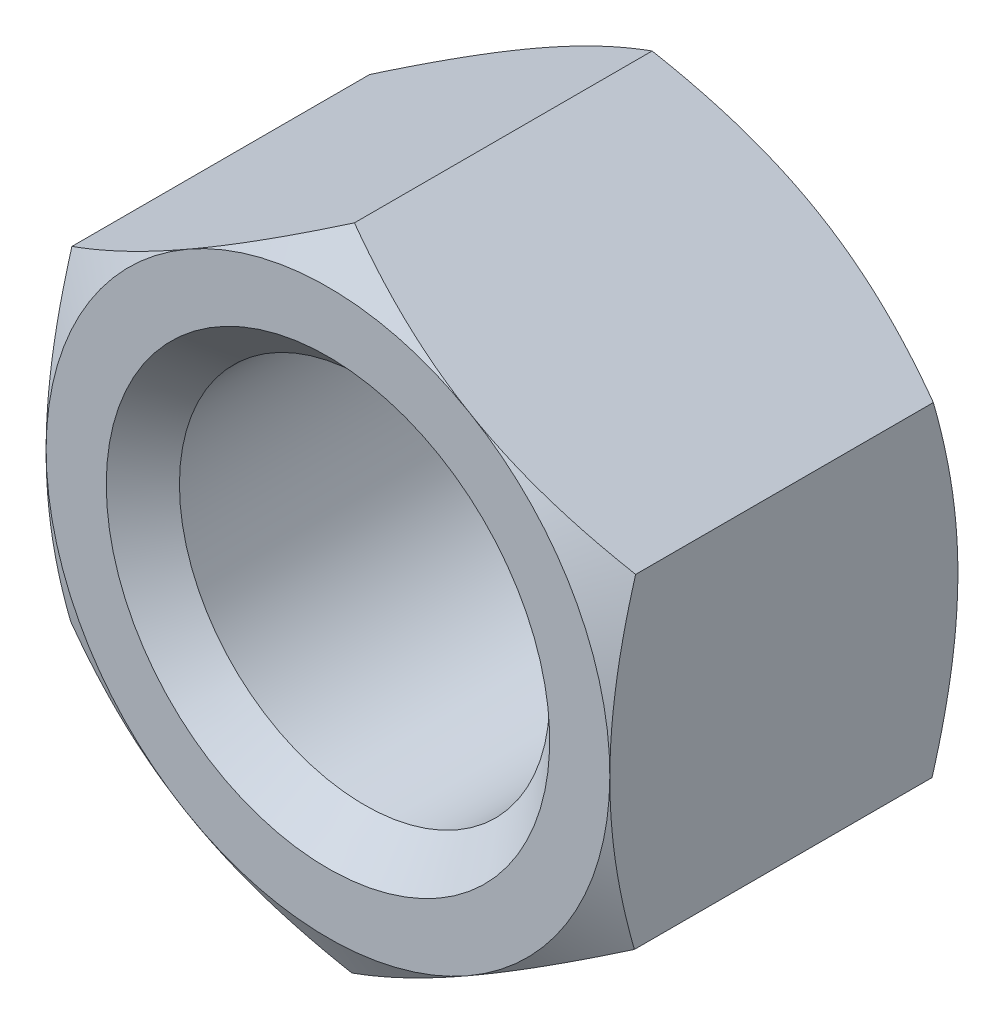
ISO-10303-21;
HEADER;
FILE_DESCRIPTION(('STEP AP214'),'2;1');
FILE_NAME('part.step','',(''),(''),'','','');
FILE_SCHEMA(('AUTOMOTIVE_DESIGN { 1 0 10303 214 1 1 1 1 }'));
ENDSEC;
DATA;
#1=APPLICATION_CONTEXT('core data for automotive mechanical design processes');
#2=APPLICATION_PROTOCOL_DEFINITION('international standard','automotive_design',2000,#1);
#3=PRODUCT_CONTEXT('',#1,'mechanical');
#4=PRODUCT('Part','Part','',(#3));
#5=PRODUCT_RELATED_PRODUCT_CATEGORY('part','',(#4));
#6=PRODUCT_DEFINITION_FORMATION('','',#4);
#7=PRODUCT_DEFINITION_CONTEXT('part definition',#1,'design');
#8=PRODUCT_DEFINITION('design','',#6,#7);
#9=PRODUCT_DEFINITION_SHAPE('','',#8);
#10=(LENGTH_UNIT() NAMED_UNIT(*) SI_UNIT(.MILLI.,.METRE.));
#11=(NAMED_UNIT(*) PLANE_ANGLE_UNIT() SI_UNIT($,.RADIAN.));
#12=(NAMED_UNIT(*) SI_UNIT($,.STERADIAN.) SOLID_ANGLE_UNIT());
#13=UNCERTAINTY_MEASURE_WITH_UNIT(LENGTH_MEASURE(1.E-05),#10,'distance_accuracy_value','');
#14=(GEOMETRIC_REPRESENTATION_CONTEXT(3) GLOBAL_UNCERTAINTY_ASSIGNED_CONTEXT((#13)) GLOBAL_UNIT_ASSIGNED_CONTEXT((#10,
#11,#12)) REPRESENTATION_CONTEXT('',''));
#15=CARTESIAN_POINT('',(0.,0.,0.));
#16=DIRECTION('',(0.,0.,1.));
#17=DIRECTION('',(1.,0.,0.));
#18=AXIS2_PLACEMENT_3D('',#15,#16,#17);
#19=CARTESIAN_POINT('',(3.81479636275758,2.18251087298359,4.7));
#20=DIRECTION('',(-0.503402758571273,-0.86405188655707,0.));
#21=DIRECTION('',(0.86405188655707,-0.503402758571273,0.));
#22=AXIS2_PLACEMENT_3D('',#19,#20,#21);
#23=PLANE('',#22);
#24=CARTESIAN_POINT('',(3.81499636275758,2.18239435156481,4.35997874533726));
#25=CARTESIAN_POINT('',(3.64811550767101,2.27962032156767,4.41575327271758));
#26=CARTESIAN_POINT('',(3.47979414686309,2.37768554042254,4.46647812454732));
#27=CARTESIAN_POINT('',(3.1402367783481,2.57551407209181,4.5550187537456));
#28=CARTESIAN_POINT('',(2.96899473728966,2.67528089997952,4.59280320888649));
#29=CARTESIAN_POINT('',(2.62863287329639,2.87357813642141,4.65162006952883));
#30=CARTESIAN_POINT('',(2.45956541847096,2.97207803494357,4.67304393485062));
#31=CARTESIAN_POINT('',(2.12063500890943,3.16954129587899,4.69861932626903));
#32=CARTESIAN_POINT('',(1.95077328605247,3.26850394059074,4.70279203126259));
#33=CARTESIAN_POINT('',(1.63337851805591,3.45342038397959,4.69411027525601));
#34=CARTESIAN_POINT('',(1.48579795454608,3.53940186719627,4.68338747949839));
#35=CARTESIAN_POINT('',(1.19159831160526,3.71080466618468,4.64940284759646));
#36=CARTESIAN_POINT('',(1.04498024971571,3.79622538912953,4.62612940280024));
#37=CARTESIAN_POINT('',(0.750174047424613,3.96798157389826,4.56794772366122));
#38=CARTESIAN_POINT('',(0.602023218516453,4.05429529778139,4.53279286465761));
#39=CARTESIAN_POINT('',(0.307931167384401,4.22563541301876,4.45300520988815));
#40=CARTESIAN_POINT('',(0.161986177547433,4.31066399941111,4.40839116089044));
#41=CARTESIAN_POINT('',(0.0170883213392543,4.3950825183231,4.35997874533726));
#42=B_SPLINE_CURVE_WITH_KNOTS('',3,(#24,#25,#26,#27,#28,#29,#30,#31,#32,#33,#34,#35,#36,#37,#38,
#39,#40,#41),.UNSPECIFIED.,.F.,.F.,(4,2,2,2,2,2,2,2,4),(0.,0.603326111642062,1.20810242030768,
1.79791084320572,2.38699495494449,2.89991736117028,3.41331500784669,3.93810051431454,
4.46185553318586),.UNSPECIFIED.);
#43=CARTESIAN_POINT('',(3.81479636275758,2.18251087298359,4.3600455669116));
#44=VERTEX_POINT('',#43);
#45=CARTESIAN_POINT('',(1.91604234204841,3.28873843494396,4.7));
#46=VERTEX_POINT('',#45);
#47=EDGE_CURVE('E63',#44,#46,#42,.T.);
#48=ORIENTED_EDGE('',*,*,#47,.F.);
#49=DIRECTION('',(0.,0.,-1.));
#50=VECTOR('',#49,1.);
#51=CARTESIAN_POINT('',(3.81479636275758,2.18251087298359,4.7));
#52=LINE('',#51,#50);
#53=CARTESIAN_POINT('',(3.81479636275758,2.18251087298359,0.339954433088404));
#54=VERTEX_POINT('',#53);
#55=EDGE_CURVE('E532',#44,#54,#52,.T.);
#56=ORIENTED_EDGE('',*,*,#55,.T.);
#57=CARTESIAN_POINT('',(0.0170883213392538,4.3950825183231,0.34002125466274));
#58=CARTESIAN_POINT('',(0.183969176425817,4.29785654832025,0.284246727282424));
#59=CARTESIAN_POINT('',(0.352290537233743,4.19979132946538,0.233521875452679));
#60=CARTESIAN_POINT('',(0.691847905748734,4.00196279779611,0.144981246254397));
#61=CARTESIAN_POINT('',(0.863089946807176,3.90219596990839,0.107196791113513));
#62=CARTESIAN_POINT('',(1.20345181080044,3.7038987334665,0.0483799304711651));
#63=CARTESIAN_POINT('',(1.37251926562587,3.60539883494435,0.026956065149377));
#64=CARTESIAN_POINT('',(1.7114496751874,3.40793557400892,0.00138067373097403));
#65=CARTESIAN_POINT('',(1.88131139804436,3.30897292929717,-0.00279203126258914));
#66=CARTESIAN_POINT('',(2.19870616604092,3.12405648590832,0.00588972474399352));
#67=CARTESIAN_POINT('',(2.34628672955075,3.03807500269164,0.0166125205016103));
#68=CARTESIAN_POINT('',(2.64048637249157,2.86667220370324,0.0505971524035392));
#69=CARTESIAN_POINT('',(2.78710443438112,2.78125148075838,0.0738705971997583));
#70=CARTESIAN_POINT('',(3.08191063667222,2.60949529598966,0.13205227633878));
#71=CARTESIAN_POINT('',(3.23006146558038,2.52318157210652,0.167207135342394));
#72=CARTESIAN_POINT('',(3.52415351671243,2.35184145686915,0.246994790111855));
#73=CARTESIAN_POINT('',(3.6700985065494,2.26681287047681,0.291608839109563));
#74=CARTESIAN_POINT('',(3.81499636275758,2.18239435156481,0.34002125466274));
#75=B_SPLINE_CURVE_WITH_KNOTS('',3,(#57,#58,#59,#60,#61,#62,#63,#64,#65,#66,#67,#68,#69,#70,#71,
#72,#73,#74),.UNSPECIFIED.,.F.,.F.,(4,2,2,2,2,2,2,2,4),(0.,0.603326111642062,1.20810242030768,
1.79791084320572,2.38699495494449,2.89991736117028,3.41331500784669,3.93810051431454,
4.46185553318586),.UNSPECIFIED.);
#76=CARTESIAN_POINT('',(1.91604234204841,3.28873843494396,0.));
#77=VERTEX_POINT('',#76);
#78=EDGE_CURVE('E235',#77,#54,#75,.T.);
#79=ORIENTED_EDGE('',*,*,#78,.F.);
#80=CARTESIAN_POINT('',(0.0172883213392539,4.39496599690433,0.339954433088403));
#81=VERTEX_POINT('',#80);
#82=EDGE_CURVE('E245',#81,#77,#75,.T.);
#83=ORIENTED_EDGE('',*,*,#82,.F.);
#84=DIRECTION('',(0.,0.,-1.));
#85=VECTOR('',#84,1.);
#86=CARTESIAN_POINT('',(0.0172883213392538,4.39496599690433,4.7));
#87=LINE('',#86,#85);
#88=CARTESIAN_POINT('',(0.0172883213392536,4.39496599690433,4.3600455669116));
#89=VERTEX_POINT('',#88);
#90=EDGE_CURVE('E293',#89,#81,#87,.T.);
#91=ORIENTED_EDGE('',*,*,#90,.F.);
#92=EDGE_CURVE('E259',#46,#89,#42,.T.);
#93=ORIENTED_EDGE('',*,*,#92,.F.);
#94=EDGE_LOOP('',(#48,#56,#79,#83,#91,#93));
#95=FACE_BOUND('',#94,.T.);
#96=ADVANCED_FACE('F40',(#95),#23,.F.);
#97=CARTESIAN_POINT('',(0.0172883213392538,4.39496599690433,4.7));
#98=DIRECTION('',(0.496589504660656,-0.867985520536422,0.));
#99=DIRECTION('',(0.867985520536423,0.496589504660656,0.));
#100=AXIS2_PLACEMENT_3D('',#97,#98,#99);
#101=PLANE('',#100);
#102=CARTESIAN_POINT('',(0.017488321339254,4.39508042035793,4.35997904817866));
#103=CARTESIAN_POINT('',(-0.15015225076765,4.29917035424052,4.41575355068716));
#104=CARTESIAN_POINT('',(-0.31923988646249,4.20243239805659,4.4664783760987));
#105=CARTESIAN_POINT('',(-0.660343072288491,4.00728137528052,4.55501895046617));
#106=CARTESIAN_POINT('',(-0.83236468322827,3.90886484119511,4.59280337722893));
#107=CARTESIAN_POINT('',(-1.17427602616556,3.71325145778042,4.65162018176994));
#108=CARTESIAN_POINT('',(-1.34411315171328,3.61608470550948,4.67304401919734));
#109=CARTESIAN_POINT('',(-1.68458652238499,3.42129401085881,4.69861935670114));
#110=CARTESIAN_POINT('',(-1.85522153002546,3.32367077646478,4.70279203565167));
#111=CARTESIAN_POINT('',(-2.17406109768527,3.14125715408943,4.69411023848355));
#112=CARTESIAN_POINT('',(-2.32231339287857,3.0564394559908,4.68338743768507));
#113=CARTESIAN_POINT('',(-2.61785212307341,2.88735664508769,4.64940281943262));
#114=CARTESIAN_POINT('',(-2.76513753590543,2.80309211708405,4.62612939338097));
#115=CARTESIAN_POINT('',(-3.06128558409591,2.63366070483395,4.56794777275672));
#116=CARTESIAN_POINT('',(-3.21011073821797,2.54851526425005,4.53279295427624));
#117=CARTESIAN_POINT('',(-3.50554138512674,2.37949428966128,4.4530053959509));
#118=CARTESIAN_POINT('',(-3.65215066266226,2.29561659033626,4.40839140279768));
#119=CARTESIAN_POINT('',(-3.79770804141832,2.21234070046715,4.35997904817866));
#120=B_SPLINE_CURVE_WITH_KNOTS('',3,(#102,#103,#104,#105,#106,#107,#108,#109,#110,#111,#112,
#113,#114,#115,#116,#117,#118,#119),.UNSPECIFIED.,.F.,.F.,(4,2,2,2,2,2,2,2,4),(0.,
0.60332603981437,1.20810227468529,1.79791063261882,2.38699468017695,2.8999166221874,
3.41331380289818,3.93809881874262,4.46185335047026),.UNSPECIFIED.);
#121=CARTESIAN_POINT('',(-1.89010986003954,3.30371056041254,4.7));
#122=VERTEX_POINT('',#121);
#123=EDGE_CURVE('E55',#89,#122,#120,.T.);
#124=ORIENTED_EDGE('',*,*,#123,.F.);
#125=ORIENTED_EDGE('',*,*,#90,.T.);
#126=CARTESIAN_POINT('',(-3.79770804141832,2.21234070046715,0.34002095182134));
#127=CARTESIAN_POINT('',(-3.63006746931142,2.30825076658455,0.284246449312835));
#128=CARTESIAN_POINT('',(-3.46097983361658,2.40498872276849,0.233521623901299));
#129=CARTESIAN_POINT('',(-3.11987664779058,2.60013974554456,0.144981049533828));
#130=CARTESIAN_POINT('',(-2.9478550368508,2.69855627962997,0.107196622771068));
#131=CARTESIAN_POINT('',(-2.60594369391351,2.89416966304465,0.0483798182300635));
#132=CARTESIAN_POINT('',(-2.43610656836579,2.9913364153156,0.026955980802663));
#133=CARTESIAN_POINT('',(-2.09563319769408,3.18612710996627,0.00138064329886411));
#134=CARTESIAN_POINT('',(-1.92499819005361,3.28375034436029,-0.00279203565166641));
#135=CARTESIAN_POINT('',(-1.6061586223938,3.46616396673565,0.00588976151645246));
#136=CARTESIAN_POINT('',(-1.4579063272005,3.55098166483428,0.016612562314933));
#137=CARTESIAN_POINT('',(-1.16236759700566,3.72006447573739,0.0505971805673747));
#138=CARTESIAN_POINT('',(-1.01508218417364,3.80432900374102,0.0738706066190288));
#139=CARTESIAN_POINT('',(-0.718934135983162,3.97376041599113,0.132052227243277));
#140=CARTESIAN_POINT('',(-0.570108981861102,4.05890585657503,0.167207045723759));
#141=CARTESIAN_POINT('',(-0.274678334952325,4.2279268311638,0.246994604049097));
#142=CARTESIAN_POINT('',(-0.128069057416808,4.31180453048881,0.291608597202315));
#143=CARTESIAN_POINT('',(0.017488321339254,4.39508042035793,0.34002095182134));
#144=B_SPLINE_CURVE_WITH_KNOTS('',3,(#126,#127,#128,#129,#130,#131,#132,#133,#134,#135,#136,
#137,#138,#139,#140,#141,#142,#143),.UNSPECIFIED.,.F.,.F.,(4,2,2,2,2,2,2,2,4),(0.,
0.603326039814369,1.20810227468529,1.79791063261882,2.38699468017695,2.89991662218741,
3.41331380289819,3.93809881874263,4.46185335047026),.UNSPECIFIED.);
#145=CARTESIAN_POINT('',(-1.89010986003954,3.30371056041254,0.));
#146=VERTEX_POINT('',#145);
#147=EDGE_CURVE('E511',#146,#81,#144,.T.);
#148=ORIENTED_EDGE('',*,*,#147,.F.);
#149=CARTESIAN_POINT('',(-3.79750804141832,2.21245512392075,0.339954433088403));
#150=VERTEX_POINT('',#149);
#151=EDGE_CURVE('E514',#150,#146,#144,.T.);
#152=ORIENTED_EDGE('',*,*,#151,.F.);
#153=DIRECTION('',(0.,0.,-1.));
#154=VECTOR('',#153,1.);
#155=CARTESIAN_POINT('',(-3.79750804141832,2.21245512392075,4.7));
#156=LINE('',#155,#154);
#157=CARTESIAN_POINT('',(-3.79750804141832,2.21245512392075,4.3600455669116));
#158=VERTEX_POINT('',#157);
#159=EDGE_CURVE('E295',#158,#150,#156,.T.);
#160=ORIENTED_EDGE('',*,*,#159,.F.);
#161=EDGE_CURVE('E136',#122,#158,#120,.T.);
#162=ORIENTED_EDGE('',*,*,#161,.F.);
#163=EDGE_LOOP('',(#124,#125,#148,#152,#160,#162));
#164=FACE_BOUND('',#163,.T.);
#165=ADVANCED_FACE('F254',(#164),#101,.F.);
#166=CARTESIAN_POINT('',(-3.79750804141832,2.21245512392075,4.7));
#167=DIRECTION('',(0.999992263231929,-0.00393363397935178,0.));
#168=DIRECTION('',(0.00393363397935178,0.999992263231929,0.));
#169=AXIS2_PLACEMENT_3D('',#166,#167,#168);
#170=PLANE('',#169);
#171=CARTESIAN_POINT('',(-3.79750725468544,2.21265512392075,4.35998782946753));
#172=CARTESIAN_POINT('',(-3.79826698498329,2.01951961004651,4.41576161078032));
#173=CARTESIAN_POINT('',(-3.79903327323299,1.82471696060797,4.46648567015591));
#174=CARTESIAN_POINT('',(-3.80057911858311,1.43173850903014,4.55502465462157));
#175=CARTESIAN_POINT('',(-3.8013587031493,1.23355572465921,4.59280825851816));
#176=CARTESIAN_POINT('',(-3.80290821088228,0.839646237164675,4.65162343631745));
#177=CARTESIAN_POINT('',(-3.80367789565017,0.643980138830693,4.67304646490597));
#178=CARTESIAN_POINT('',(-3.80522088647815,0.251727352141737,4.69862023907755));
#179=CARTESIAN_POINT('',(-3.80599418693057,0.0551420893452341,4.70279216287316));
#180=CARTESIAN_POINT('',(-3.80743911956437,-0.312182746233546,4.6941091721832));
#181=CARTESIAN_POINT('',(-3.80811096813968,-0.48297732979248,4.68338622522927));
#182=CARTESIAN_POINT('',(-3.80945028823957,-0.823453781060173,4.64940200277782));
#183=CARTESIAN_POINT('',(-3.81011775513232,-0.993134471287867,4.62612912025456));
#184=CARTESIAN_POINT('',(-3.81145983624734,-1.33431281647499,4.56794919634917));
#185=CARTESIAN_POINT('',(-3.8121342806236,-1.50576729388214,4.5327955528906));
#186=CARTESIAN_POINT('',(-3.8134731106813,-1.84611916863959,4.45301079108927));
#187=CARTESIAN_POINT('',(-3.81413751351272,-2.01502092578745,4.40839841722002));
#188=CARTESIAN_POINT('',(-3.81479714949046,-2.18271087298358,4.35998782946753));
#189=B_SPLINE_CURVE_WITH_KNOTS('',3,(#171,#172,#173,#174,#175,#176,#177,#178,#179,#180,#181,
#182,#183,#184,#185,#186,#187,#188),.UNSPECIFIED.,.F.,.F.,(4,2,2,2,2,2,2,2,4),(0.,
0.60332395707428,1.20809805216939,1.7979045263706,2.38698671292602,2.89989519431242,
3.41327886364876,3.93804965314254,4.46179005941606),.UNSPECIFIED.);
#190=CARTESIAN_POINT('',(-3.80615220208795,0.01497212546858,4.7));
#191=VERTEX_POINT('',#190);
#192=EDGE_CURVE('E129',#158,#191,#189,.T.);
#193=ORIENTED_EDGE('',*,*,#192,.F.);
#194=ORIENTED_EDGE('',*,*,#159,.T.);
#195=CARTESIAN_POINT('',(-3.81479714949046,-2.18271087298358,0.340012170532471));
#196=CARTESIAN_POINT('',(-3.8140374191926,-1.98957535910935,0.284238389219678));
#197=CARTESIAN_POINT('',(-3.81327113094291,-1.79477270967081,0.233514329844086));
#198=CARTESIAN_POINT('',(-3.81172528559279,-1.40179425809298,0.144975345378434));
#199=CARTESIAN_POINT('',(-3.8109457010266,-1.20361147372205,0.10719174148184));
#200=CARTESIAN_POINT('',(-3.80939619329362,-0.809701986227513,0.0483765636825481));
#201=CARTESIAN_POINT('',(-3.80862650852573,-0.61403588789353,0.0269535350940257));
#202=CARTESIAN_POINT('',(-3.80708351769775,-0.221783101204574,0.0013797609224457));
#203=CARTESIAN_POINT('',(-3.80631021724533,-0.0251978384080715,-0.00279216287316199));
#204=CARTESIAN_POINT('',(-3.80486528461153,0.342126997170708,0.00589082781679917));
#205=CARTESIAN_POINT('',(-3.80419343603622,0.512921580729643,0.0166137747707315));
#206=CARTESIAN_POINT('',(-3.80285411593633,0.853398031997335,0.0505979972221797));
#207=CARTESIAN_POINT('',(-3.80218664904357,1.02307872222503,0.0738708797454446));
#208=CARTESIAN_POINT('',(-3.80084456792856,1.36425706741215,0.13205080365083));
#209=CARTESIAN_POINT('',(-3.8001701235523,1.5357115448193,0.167204447109405));
#210=CARTESIAN_POINT('',(-3.7988312934946,1.87606341957676,0.246989208910728));
#211=CARTESIAN_POINT('',(-3.79816689066318,2.04496517672461,0.29160158277998));
#212=CARTESIAN_POINT('',(-3.79750725468544,2.21265512392075,0.340012170532472));
#213=B_SPLINE_CURVE_WITH_KNOTS('',3,(#195,#196,#197,#198,#199,#200,#201,#202,#203,#204,#205,
#206,#207,#208,#209,#210,#211,#212),.UNSPECIFIED.,.F.,.F.,(4,2,2,2,2,2,2,2,4),(0.,
0.60332395707428,1.20809805216939,1.7979045263706,2.38698671292602,2.89989519431242,
3.41327886364876,3.93804965314254,4.46179005941606),.UNSPECIFIED.);
#214=CARTESIAN_POINT('',(-3.80615220208795,0.0149721254685802,0.));
#215=VERTEX_POINT('',#214);
#216=EDGE_CURVE('E516',#215,#150,#213,.T.);
#217=ORIENTED_EDGE('',*,*,#216,.F.);
#218=CARTESIAN_POINT('',(-3.81479636275757,-2.18251087298358,0.339954433088402));
#219=VERTEX_POINT('',#218);
#220=EDGE_CURVE('E519',#219,#215,#213,.T.);
#221=ORIENTED_EDGE('',*,*,#220,.F.);
#222=DIRECTION('',(0.,0.,-1.));
#223=VECTOR('',#222,1.);
#224=CARTESIAN_POINT('',(-3.81479636275757,-2.18251087298358,4.7));
#225=LINE('',#224,#223);
#226=CARTESIAN_POINT('',(-3.81479636275757,-2.18251087298358,4.3600455669116));
#227=VERTEX_POINT('',#226);
#228=EDGE_CURVE('E163',#227,#219,#225,.T.);
#229=ORIENTED_EDGE('',*,*,#228,.F.);
#230=EDGE_CURVE('E140',#191,#227,#189,.T.);
#231=ORIENTED_EDGE('',*,*,#230,.F.);
#232=EDGE_LOOP('',(#193,#194,#217,#221,#229,#231));
#233=FACE_BOUND('',#232,.T.);
#234=ADVANCED_FACE('F161',(#233),#170,.F.);
#235=CARTESIAN_POINT('',(-3.81479636275757,-2.18251087298358,4.7));
#236=DIRECTION('',(0.503402758571273,0.86405188655707,0.));
#237=DIRECTION('',(-0.864051886557071,0.503402758571273,0.));
#238=AXIS2_PLACEMENT_3D('',#235,#236,#237);
#239=PLANE('',#238);
#240=CARTESIAN_POINT('',(-3.81499636275757,-2.18239435156481,4.35997874533726));
#241=CARTESIAN_POINT('',(-3.64811550767101,-2.27962032156767,4.41575327271758));
#242=CARTESIAN_POINT('',(-3.47979414686309,-2.37768554042254,4.46647812454732));
#243=CARTESIAN_POINT('',(-3.14023677834809,-2.57551407209181,4.5550187537456));
#244=CARTESIAN_POINT('',(-2.96899473728965,-2.67528089997952,4.59280320888649));
#245=CARTESIAN_POINT('',(-2.62863287329639,-2.87357813642141,4.65162006952884));
#246=CARTESIAN_POINT('',(-2.45956541847096,-2.97207803494357,4.67304393485062));
#247=CARTESIAN_POINT('',(-2.12063500890943,-3.16954129587899,4.69861932626903));
#248=CARTESIAN_POINT('',(-1.95077328605247,-3.26850394059074,4.70279203126259));
#249=CARTESIAN_POINT('',(-1.6333785180559,-3.45342038397959,4.69411027525601));
#250=CARTESIAN_POINT('',(-1.48579795454608,-3.53940186719627,4.68338747949839));
#251=CARTESIAN_POINT('',(-1.19159831160526,-3.71080466618468,4.64940284759646));
#252=CARTESIAN_POINT('',(-1.04498024971571,-3.79622538912953,4.62612940280024));
#253=CARTESIAN_POINT('',(-0.750174047424611,-3.96798157389826,4.56794772366122));
#254=CARTESIAN_POINT('',(-0.602023218516451,-4.05429529778139,4.53279286465761));
#255=CARTESIAN_POINT('',(-0.307931167384398,-4.22563541301876,4.45300520988815));
#256=CARTESIAN_POINT('',(-0.16198617754743,-4.31066399941111,4.40839116089044));
#257=CARTESIAN_POINT('',(-0.0170883213392506,-4.3950825183231,4.35997874533726));
#258=B_SPLINE_CURVE_WITH_KNOTS('',3,(#240,#241,#242,#243,#244,#245,#246,#247,#248,#249,#250,
#251,#252,#253,#254,#255,#256,#257),.UNSPECIFIED.,.F.,.F.,(4,2,2,2,2,2,2,2,4),(0.,
0.603326111642061,1.20810242030768,1.79791084320572,2.38699495494448,2.89991736117028,
3.41331500784669,3.93810051431454,4.46185553318586),.UNSPECIFIED.);
#259=CARTESIAN_POINT('',(-1.91604234204841,-3.28873843494396,4.7));
#260=VERTEX_POINT('',#259);
#261=EDGE_CURVE('E148',#227,#260,#258,.T.);
#262=ORIENTED_EDGE('',*,*,#261,.F.);
#263=ORIENTED_EDGE('',*,*,#228,.T.);
#264=CARTESIAN_POINT('',(-0.0170883213392507,-4.3950825183231,0.34002125466274));
#265=CARTESIAN_POINT('',(-0.183969176425814,-4.29785654832025,0.284246727282423));
#266=CARTESIAN_POINT('',(-0.35229053723374,-4.19979132946538,0.233521875452678));
#267=CARTESIAN_POINT('',(-0.691847905748732,-4.00196279779611,0.144981246254397));
#268=CARTESIAN_POINT('',(-0.863089946807173,-3.90219596990839,0.107196791113512));
#269=CARTESIAN_POINT('',(-1.20345181080043,-3.7038987334665,0.0483799304711644));
#270=CARTESIAN_POINT('',(-1.37251926562587,-3.60539883494435,0.0269560651493762));
#271=CARTESIAN_POINT('',(-1.7114496751874,-3.40793557400892,0.00138067373097309));
#272=CARTESIAN_POINT('',(-1.88131139804436,-3.30897292929717,-0.00279203126259013));
#273=CARTESIAN_POINT('',(-2.19870616604092,-3.12405648590832,0.0058897247439924));
#274=CARTESIAN_POINT('',(-2.34628672955075,-3.03807500269164,0.0166125205016091));
#275=CARTESIAN_POINT('',(-2.64048637249157,-2.86667220370324,0.0505971524035379));
#276=CARTESIAN_POINT('',(-2.78710443438112,-2.78125148075838,0.073870597199757));
#277=CARTESIAN_POINT('',(-3.08191063667221,-2.60949529598966,0.132052276338778));
#278=CARTESIAN_POINT('',(-3.23006146558038,-2.52318157210652,0.167207135342392));
#279=CARTESIAN_POINT('',(-3.52415351671243,-2.35184145686915,0.246994790111853));
#280=CARTESIAN_POINT('',(-3.6700985065494,-2.2668128704768,0.291608839109562));
#281=CARTESIAN_POINT('',(-3.81499636275757,-2.18239435156481,0.340021254662739));
#282=B_SPLINE_CURVE_WITH_KNOTS('',3,(#264,#265,#266,#267,#268,#269,#270,#271,#272,#273,#274,
#275,#276,#277,#278,#279,#280,#281),.UNSPECIFIED.,.F.,.F.,(4,2,2,2,2,2,2,2,4),(0.,
0.603326111642062,1.20810242030768,1.79791084320572,2.38699495494449,2.89991736117028,
3.41331500784669,3.93810051431454,4.46185553318586),.UNSPECIFIED.);
#283=CARTESIAN_POINT('',(-1.91604234204841,-3.28873843494396,0.));
#284=VERTEX_POINT('',#283);
#285=EDGE_CURVE('E512',#284,#219,#282,.T.);
#286=ORIENTED_EDGE('',*,*,#285,.F.);
#287=CARTESIAN_POINT('',(-0.0172883213392506,-4.39496599690433,0.339954433088403));
#288=VERTEX_POINT('',#287);
#289=EDGE_CURVE('E246',#288,#284,#282,.T.);
#290=ORIENTED_EDGE('',*,*,#289,.F.);
#291=DIRECTION('',(0.,0.,-1.));
#292=VECTOR('',#291,1.);
#293=CARTESIAN_POINT('',(-0.0172883213392506,-4.39496599690433,4.7));
#294=LINE('',#293,#292);
#295=CARTESIAN_POINT('',(-0.0172883213392505,-4.39496599690433,4.3600455669116));
#296=VERTEX_POINT('',#295);
#297=EDGE_CURVE('E535',#296,#288,#294,.T.);
#298=ORIENTED_EDGE('',*,*,#297,.F.);
#299=EDGE_CURVE('E164',#260,#296,#258,.T.);
#300=ORIENTED_EDGE('',*,*,#299,.F.);
#301=EDGE_LOOP('',(#262,#263,#286,#290,#298,#300));
#302=FACE_BOUND('',#301,.T.);
#303=ADVANCED_FACE('F220',(#302),#239,.F.);
#304=CARTESIAN_POINT('',(-0.0172883213392506,-4.39496599690433,4.7));
#305=DIRECTION('',(-0.496589504660656,0.867985520536422,0.));
#306=DIRECTION('',(-0.867985520536423,-0.496589504660656,0.));
#307=AXIS2_PLACEMENT_3D('',#304,#305,#306);
#308=PLANE('',#307);
#309=CARTESIAN_POINT('',(-0.0174883213392508,-4.39508042035793,4.35997904817866));
#310=CARTESIAN_POINT('',(0.150152250767653,-4.29917035424053,4.41575355068716));
#311=CARTESIAN_POINT('',(0.319239886462492,-4.20243239805659,4.4664783760987));
#312=CARTESIAN_POINT('',(0.660343072288493,-4.00728137528052,4.55501895046617));
#313=CARTESIAN_POINT('',(0.832364683228273,-3.90886484119511,4.59280337722893));
#314=CARTESIAN_POINT('',(1.17427602616556,-3.71325145778042,4.65162018176994));
#315=CARTESIAN_POINT('',(1.34411315171328,-3.61608470550948,4.67304401919734));
#316=CARTESIAN_POINT('',(1.68458652238499,-3.42129401085881,4.69861935670114));
#317=CARTESIAN_POINT('',(1.85522153002546,-3.32367077646478,4.70279203565167));
#318=CARTESIAN_POINT('',(2.17406109768528,-3.14125715408943,4.69411023848355));
#319=CARTESIAN_POINT('',(2.32231339287857,-3.0564394559908,4.68338743768507));
#320=CARTESIAN_POINT('',(2.61785212307341,-2.88735664508769,4.64940281943262));
#321=CARTESIAN_POINT('',(2.76513753590543,-2.80309211708405,4.62612939338097));
#322=CARTESIAN_POINT('',(3.06128558409591,-2.63366070483395,4.56794777275672));
#323=CARTESIAN_POINT('',(3.21011073821797,-2.54851526425005,4.53279295427624));
#324=CARTESIAN_POINT('',(3.50554138512674,-2.37949428966128,4.4530053959509));
#325=CARTESIAN_POINT('',(3.65215066266226,-2.29561659033626,4.40839140279768));
#326=CARTESIAN_POINT('',(3.79770804141832,-2.21234070046715,4.35997904817866));
#327=B_SPLINE_CURVE_WITH_KNOTS('',3,(#309,#310,#311,#312,#313,#314,#315,#316,#317,#318,#319,
#320,#321,#322,#323,#324,#325,#326),.UNSPECIFIED.,.F.,.F.,(4,2,2,2,2,2,2,2,4),(0.,
0.603326039814368,1.20810227468529,1.79791063261882,2.38699468017695,2.8999166221874,
3.41331380289818,3.93809881874262,4.46185335047025),.UNSPECIFIED.);
#328=CARTESIAN_POINT('',(1.89010986003954,-3.30371056041254,4.7));
#329=VERTEX_POINT('',#328);
#330=EDGE_CURVE('E214',#296,#329,#327,.T.);
#331=ORIENTED_EDGE('',*,*,#330,.F.);
#332=ORIENTED_EDGE('',*,*,#297,.T.);
#333=CARTESIAN_POINT('',(3.79770804141832,-2.21234070046715,0.340020951821341));
#334=CARTESIAN_POINT('',(3.63006746931142,-2.30825076658455,0.284246449312835));
#335=CARTESIAN_POINT('',(3.46097983361658,-2.40498872276849,0.2335216239013));
#336=CARTESIAN_POINT('',(3.11987664779058,-2.60013974554456,0.144981049533828));
#337=CARTESIAN_POINT('',(2.9478550368508,-2.69855627962997,0.107196622771068));
#338=CARTESIAN_POINT('',(2.60594369391351,-2.89416966304466,0.0483798182300642));
#339=CARTESIAN_POINT('',(2.43610656836579,-2.9913364153156,0.0269559808026637));
#340=CARTESIAN_POINT('',(2.09563319769408,-3.18612710996627,0.00138064329886489));
#341=CARTESIAN_POINT('',(1.92499819005361,-3.28375034436029,-0.00279203565166565));
#342=CARTESIAN_POINT('',(1.6061586223938,-3.46616396673565,0.0058897615164532));
#343=CARTESIAN_POINT('',(1.4579063272005,-3.55098166483428,0.0166125623149337));
#344=CARTESIAN_POINT('',(1.16236759700566,-3.72006447573739,0.0505971805673755));
#345=CARTESIAN_POINT('',(1.01508218417364,-3.80432900374102,0.0738706066190296));
#346=CARTESIAN_POINT('',(0.718934135983165,-3.97376041599113,0.132052227243277));
#347=CARTESIAN_POINT('',(0.570108981861104,-4.05890585657503,0.167207045723759));
#348=CARTESIAN_POINT('',(0.274678334952328,-4.2279268311638,0.246994604049097));
#349=CARTESIAN_POINT('',(0.128069057416811,-4.31180453048881,0.291608597202315));
#350=CARTESIAN_POINT('',(-0.0174883213392506,-4.39508042035793,0.34002095182134));
#351=B_SPLINE_CURVE_WITH_KNOTS('',3,(#333,#334,#335,#336,#337,#338,#339,#340,#341,#342,#343,
#344,#345,#346,#347,#348,#349,#350),.UNSPECIFIED.,.F.,.F.,(4,2,2,2,2,2,2,2,4),(0.,
0.60332603981437,1.20810227468529,1.79791063261882,2.38699468017695,2.8999166221874,
3.41331380289818,3.93809881874262,4.46185335047025),.UNSPECIFIED.);
#352=CARTESIAN_POINT('',(1.89010986003954,-3.30371056041254,0.));
#353=VERTEX_POINT('',#352);
#354=EDGE_CURVE('E237',#353,#288,#351,.T.);
#355=ORIENTED_EDGE('',*,*,#354,.F.);
#356=CARTESIAN_POINT('',(3.79750804141832,-2.21245512392075,0.339954433088403));
#357=VERTEX_POINT('',#356);
#358=EDGE_CURVE('E227',#357,#353,#351,.T.);
#359=ORIENTED_EDGE('',*,*,#358,.F.);
#360=DIRECTION('',(0.,0.,-1.));
#361=VECTOR('',#360,1.);
#362=CARTESIAN_POINT('',(3.79750804141832,-2.21245512392075,4.7));
#363=LINE('',#362,#361);
#364=CARTESIAN_POINT('',(3.79750804141832,-2.21245512392075,4.3600455669116));
#365=VERTEX_POINT('',#364);
#366=EDGE_CURVE('E292',#365,#357,#363,.T.);
#367=ORIENTED_EDGE('',*,*,#366,.F.);
#368=EDGE_CURVE('E207',#329,#365,#327,.T.);
#369=ORIENTED_EDGE('',*,*,#368,.F.);
#370=EDGE_LOOP('',(#331,#332,#355,#359,#367,#369));
#371=FACE_BOUND('',#370,.T.);
#372=ADVANCED_FACE('F216',(#371),#308,.F.);
#373=CARTESIAN_POINT('',(3.79750804141832,-2.21245512392075,4.7));
#374=DIRECTION('',(-0.999992263231929,0.00393363397935207,0.));
#375=DIRECTION('',(-0.00393363397935207,-0.999992263231929,0.));
#376=AXIS2_PLACEMENT_3D('',#373,#374,#375);
#377=PLANE('',#376);
#378=CARTESIAN_POINT('',(3.79750725468544,-2.21265512392075,4.35998782946753));
#379=CARTESIAN_POINT('',(3.79826698498329,-2.01951961004651,4.41576161078032));
#380=CARTESIAN_POINT('',(3.79903327323299,-1.82471696060797,4.46648567015591));
#381=CARTESIAN_POINT('',(3.80057911858312,-1.43173850903014,4.55502465462156));
#382=CARTESIAN_POINT('',(3.8013587031493,-1.23355572465921,4.59280825851816));
#383=CARTESIAN_POINT('',(3.80290821088228,-0.839646237164674,4.65162343631745));
#384=CARTESIAN_POINT('',(3.80367789565017,-0.643980138830692,4.67304646490597));
#385=CARTESIAN_POINT('',(3.80522088647815,-0.251727352141735,4.69862023907755));
#386=CARTESIAN_POINT('',(3.80599418693057,-0.0551420893452329,4.70279216287316));
#387=CARTESIAN_POINT('',(3.80743911956437,0.312182746233547,4.6941091721832));
#388=CARTESIAN_POINT('',(3.80811096813968,0.482977329792482,4.68338622522927));
#389=CARTESIAN_POINT('',(3.80945028823957,0.823453781060173,4.64940200277782));
#390=CARTESIAN_POINT('',(3.81011775513233,0.993134471287868,4.62612912025455));
#391=CARTESIAN_POINT('',(3.81145983624734,1.33431281647499,4.56794919634917));
#392=CARTESIAN_POINT('',(3.8121342806236,1.50576729388214,4.53279555289059));
#393=CARTESIAN_POINT('',(3.8134731106813,1.84611916863959,4.45301079108927));
#394=CARTESIAN_POINT('',(3.81413751351272,2.01502092578745,4.40839841722002));
#395=CARTESIAN_POINT('',(3.81479714949046,2.18271087298359,4.35998782946753));
#396=B_SPLINE_CURVE_WITH_KNOTS('',3,(#378,#379,#380,#381,#382,#383,#384,#385,#386,#387,#388,
#389,#390,#391,#392,#393,#394,#395),.UNSPECIFIED.,.F.,.F.,(4,2,2,2,2,2,2,2,4),(0.,
0.60332395707428,1.20809805216939,1.7979045263706,2.38698671292602,2.89989519431242,
3.41327886364876,3.93804965314254,4.46179005941606),.UNSPECIFIED.);
#397=CARTESIAN_POINT('',(3.80615220208795,-0.0149721254685812,4.7));
#398=VERTEX_POINT('',#397);
#399=EDGE_CURVE('E215',#365,#398,#396,.T.);
#400=ORIENTED_EDGE('',*,*,#399,.F.);
#401=ORIENTED_EDGE('',*,*,#366,.T.);
#402=CARTESIAN_POINT('',(3.81479714949046,2.18271087298359,0.340012170532473));
#403=CARTESIAN_POINT('',(3.81403741919261,1.98957535910935,0.284238389219679));
#404=CARTESIAN_POINT('',(3.81327113094291,1.79477270967081,0.233514329844087));
#405=CARTESIAN_POINT('',(3.81172528559279,1.40179425809298,0.144975345378435));
#406=CARTESIAN_POINT('',(3.8109457010266,1.20361147372205,0.107191741481841));
#407=CARTESIAN_POINT('',(3.80939619329362,0.809701986227512,0.0483765636825496));
#408=CARTESIAN_POINT('',(3.80862650852573,0.61403588789353,0.026953535094027));
#409=CARTESIAN_POINT('',(3.80708351769775,0.221783101204573,0.0013797609224468));
#410=CARTESIAN_POINT('',(3.80631021724533,0.025197838408071,-0.00279216287316089));
#411=CARTESIAN_POINT('',(3.80486528461153,-0.342126997170709,0.00589082781680025));
#412=CARTESIAN_POINT('',(3.80419343603622,-0.512921580729643,0.0166137747707326));
#413=CARTESIAN_POINT('',(3.80285411593633,-0.853398031997335,0.0505979972221807));
#414=CARTESIAN_POINT('',(3.80218664904358,-1.02307872222503,0.0738708797454456));
#415=CARTESIAN_POINT('',(3.80084456792856,-1.36425706741215,0.132050803650831));
#416=CARTESIAN_POINT('',(3.8001701235523,-1.5357115448193,0.167204447109406));
#417=CARTESIAN_POINT('',(3.7988312934946,-1.87606341957676,0.246989208910729));
#418=CARTESIAN_POINT('',(3.79816689066318,-2.04496517672461,0.29160158277998));
#419=CARTESIAN_POINT('',(3.79750725468544,-2.21265512392075,0.340012170532473));
#420=B_SPLINE_CURVE_WITH_KNOTS('',3,(#402,#403,#404,#405,#406,#407,#408,#409,#410,#411,#412,
#413,#414,#415,#416,#417,#418,#419),.UNSPECIFIED.,.F.,.F.,(4,2,2,2,2,2,2,2,4),(0.,
0.60332395707428,1.20809805216939,1.7979045263706,2.38698671292602,2.89989519431242,
3.41327886364876,3.93804965314254,4.46179005941606),.UNSPECIFIED.);
#421=CARTESIAN_POINT('',(3.80615220208795,-0.0149721254685812,0.));
#422=VERTEX_POINT('',#421);
#423=EDGE_CURVE('E284',#422,#357,#420,.T.);
#424=ORIENTED_EDGE('',*,*,#423,.F.);
#425=EDGE_CURVE('E153',#54,#422,#420,.T.);
#426=ORIENTED_EDGE('',*,*,#425,.F.);
#427=ORIENTED_EDGE('',*,*,#55,.F.);
#428=EDGE_CURVE('E198',#398,#44,#396,.T.);
#429=ORIENTED_EDGE('',*,*,#428,.F.);
#430=EDGE_LOOP('',(#400,#401,#424,#426,#427,#429));
#431=FACE_BOUND('',#430,.T.);
#432=ADVANCED_FACE('F219',(#431),#377,.F.);
#433=CARTESIAN_POINT('',(3.81479636275758,2.18251087298359,4.7));
#434=DIRECTION('',(0.,0.,-1.));
#435=DIRECTION('',(-1.,0.,0.));
#436=AXIS2_PLACEMENT_3D('',#433,#434,#435);
#437=PLANE('',#436);
#438=CARTESIAN_POINT('',(0.,0.,4.7));
#439=DIRECTION('',(0.,0.,-1.));
#440=DIRECTION('',(-1.,0.,0.));
#441=AXIS2_PLACEMENT_3D('',#438,#439,#440);
#442=CIRCLE('',#441,2.99404761904762);
#443=CARTESIAN_POINT('',(-2.99404761904762,0.,4.7));
#444=VERTEX_POINT('',#443);
#445=EDGE_CURVE('E12',#444,#444,#442,.T.);
#446=ORIENTED_EDGE('',*,*,#445,.T.);
#447=EDGE_LOOP('',(#446));
#448=FACE_BOUND('',#447,.T.);
#449=CARTESIAN_POINT('',(0.,0.,4.7));
#450=DIRECTION('',(0.,0.,-1.));
#451=DIRECTION('',(-1.,0.,0.));
#452=AXIS2_PLACEMENT_3D('',#449,#450,#451);
#453=CIRCLE('',#452,3.80618164963261);
#454=EDGE_CURVE('E133',#191,#122,#453,.T.);
#455=ORIENTED_EDGE('',*,*,#454,.F.);
#456=EDGE_CURVE('E145',#260,#191,#453,.T.);
#457=ORIENTED_EDGE('',*,*,#456,.F.);
#458=EDGE_CURVE('E152',#329,#260,#453,.T.);
#459=ORIENTED_EDGE('',*,*,#458,.F.);
#460=EDGE_CURVE('E542',#398,#329,#453,.T.);
#461=ORIENTED_EDGE('',*,*,#460,.F.);
#462=EDGE_CURVE('E159',#46,#398,#453,.T.);
#463=ORIENTED_EDGE('',*,*,#462,.F.);
#464=CARTESIAN_POINT('',(0.,0.,4.7));
#465=DIRECTION('',(0.,0.,1.));
#466=DIRECTION('',(1.,0.,0.));
#467=AXIS2_PLACEMENT_3D('',#464,#465,#466);
#468=CIRCLE('',#467,3.80618164963261);
#469=EDGE_CURVE('E157',#46,#122,#468,.T.);
#470=ORIENTED_EDGE('',*,*,#469,.T.);
#471=EDGE_LOOP('',(#455,#457,#459,#461,#463,#470));
#472=FACE_BOUND('',#471,.T.);
#473=ADVANCED_FACE('F155',(#448,#472),#437,.F.);
#474=CARTESIAN_POINT('',(3.81479636275758,2.18251087298359,0.));
#475=DIRECTION('',(0.,0.,-1.));
#476=DIRECTION('',(-1.,0.,0.));
#477=AXIS2_PLACEMENT_3D('',#474,#475,#476);
#478=PLANE('',#477);
#479=CARTESIAN_POINT('',(0.,0.,0.));
#480=DIRECTION('',(0.,0.,-1.));
#481=DIRECTION('',(-1.,0.,0.));
#482=AXIS2_PLACEMENT_3D('',#479,#480,#481);
#483=CIRCLE('',#482,2.99404761904762);
#484=CARTESIAN_POINT('',(-2.99404761904762,0.,0.));
#485=VERTEX_POINT('',#484);
#486=EDGE_CURVE('E158',#485,#485,#483,.F.);
#487=ORIENTED_EDGE('',*,*,#486,.T.);
#488=EDGE_LOOP('',(#487));
#489=FACE_BOUND('',#488,.T.);
#490=CARTESIAN_POINT('',(0.,0.,0.));
#491=DIRECTION('',(0.,0.,-1.));
#492=DIRECTION('',(-1.,0.,0.));
#493=AXIS2_PLACEMENT_3D('',#490,#491,#492);
#494=CIRCLE('',#493,3.80618164963261);
#495=EDGE_CURVE('E265',#284,#215,#494,.T.);
#496=ORIENTED_EDGE('',*,*,#495,.T.);
#497=EDGE_CURVE('E236',#215,#146,#494,.T.);
#498=ORIENTED_EDGE('',*,*,#497,.T.);
#499=EDGE_CURVE('E272',#146,#77,#494,.T.);
#500=ORIENTED_EDGE('',*,*,#499,.T.);
#501=EDGE_CURVE('E275',#77,#422,#494,.T.);
#502=ORIENTED_EDGE('',*,*,#501,.T.);
#503=EDGE_CURVE('E271',#422,#353,#494,.T.);
#504=ORIENTED_EDGE('',*,*,#503,.T.);
#505=EDGE_CURVE('E267',#353,#284,#494,.T.);
#506=ORIENTED_EDGE('',*,*,#505,.T.);
#507=EDGE_LOOP('',(#496,#498,#500,#502,#504,#506));
#508=FACE_BOUND('',#507,.T.);
#509=ADVANCED_FACE('F279',(#489,#508),#478,.T.);
#510=CARTESIAN_POINT('',(0.,0.,4.7));
#511=DIRECTION('',(0.,0.,-1.));
#512=DIRECTION('',(-1.,0.,0.));
#513=AXIS2_PLACEMENT_3D('',#510,#511,#512);
#514=CYLINDRICAL_SURFACE('',#513,2.5);
#515=CARTESIAN_POINT('',(0.,0.,0.494047619047621));
#516=DIRECTION('',(0.,0.,-1.));
#517=DIRECTION('',(-1.,0.,0.));
#518=AXIS2_PLACEMENT_3D('',#515,#516,#517);
#519=CIRCLE('',#518,2.5);
#520=CARTESIAN_POINT('',(-2.5,0.,0.494047619047621));
#521=VERTEX_POINT('',#520);
#522=EDGE_CURVE('E48',#521,#521,#519,.T.);
#523=ORIENTED_EDGE('',*,*,#522,.T.);
#524=EDGE_LOOP('',(#523));
#525=FACE_BOUND('',#524,.T.);
#526=CARTESIAN_POINT('',(0.,0.,4.20595238095238));
#527=DIRECTION('',(0.,0.,-1.));
#528=DIRECTION('',(-1.,0.,0.));
#529=AXIS2_PLACEMENT_3D('',#526,#527,#528);
#530=CIRCLE('',#529,2.5);
#531=CARTESIAN_POINT('',(-2.5,0.,4.20595238095238));
#532=VERTEX_POINT('',#531);
#533=EDGE_CURVE('E305',#532,#532,#530,.F.);
#534=ORIENTED_EDGE('',*,*,#533,.T.);
#535=EDGE_LOOP('',(#534));
#536=FACE_BOUND('',#535,.T.);
#537=ADVANCED_FACE('F310',(#525,#536),#514,.F.);
#538=CARTESIAN_POINT('',(0.,0.,0.));
#539=DIRECTION('',(0.,0.,1.));
#540=DIRECTION('',(-1.,0.,0.));
#541=AXIS2_PLACEMENT_3D('',#538,#539,#540);
#542=CONICAL_SURFACE('',#541,3.80618164963261,1.0471975511966);
#543=ORIENTED_EDGE('',*,*,#358,.T.);
#544=ORIENTED_EDGE('',*,*,#503,.F.);
#545=ORIENTED_EDGE('',*,*,#423,.T.);
#546=EDGE_LOOP('',(#543,#544,#545));
#547=FACE_BOUND('',#546,.T.);
#548=ADVANCED_FACE('F283',(#547),#542,.T.);
#549=ORIENTED_EDGE('',*,*,#78,.T.);
#550=ORIENTED_EDGE('',*,*,#425,.T.);
#551=ORIENTED_EDGE('',*,*,#501,.F.);
#552=EDGE_LOOP('',(#549,#550,#551));
#553=FACE_BOUND('',#552,.T.);
#554=ADVANCED_FACE('F401',(#553),#542,.T.);
#555=ORIENTED_EDGE('',*,*,#289,.T.);
#556=ORIENTED_EDGE('',*,*,#505,.F.);
#557=ORIENTED_EDGE('',*,*,#354,.T.);
#558=EDGE_LOOP('',(#555,#556,#557));
#559=FACE_BOUND('',#558,.T.);
#560=ADVANCED_FACE('F382',(#559),#542,.T.);
#561=ORIENTED_EDGE('',*,*,#220,.T.);
#562=ORIENTED_EDGE('',*,*,#495,.F.);
#563=ORIENTED_EDGE('',*,*,#285,.T.);
#564=EDGE_LOOP('',(#561,#562,#563));
#565=FACE_BOUND('',#564,.T.);
#566=ADVANCED_FACE('F192',(#565),#542,.T.);
#567=ORIENTED_EDGE('',*,*,#216,.T.);
#568=ORIENTED_EDGE('',*,*,#151,.T.);
#569=ORIENTED_EDGE('',*,*,#497,.F.);
#570=EDGE_LOOP('',(#567,#568,#569));
#571=FACE_BOUND('',#570,.T.);
#572=ADVANCED_FACE('F380',(#571),#542,.T.);
#573=ORIENTED_EDGE('',*,*,#147,.T.);
#574=ORIENTED_EDGE('',*,*,#82,.T.);
#575=ORIENTED_EDGE('',*,*,#499,.F.);
#576=EDGE_LOOP('',(#573,#574,#575));
#577=FACE_BOUND('',#576,.T.);
#578=ADVANCED_FACE('F373',(#577),#542,.T.);
#579=CARTESIAN_POINT('',(0.,0.,4.7));
#580=DIRECTION('',(0.,0.,-1.));
#581=DIRECTION('',(1.,0.,0.));
#582=AXIS2_PLACEMENT_3D('',#579,#580,#581);
#583=CONICAL_SURFACE('',#582,3.80618164963261,1.0471975511966);
#584=ORIENTED_EDGE('',*,*,#230,.T.);
#585=ORIENTED_EDGE('',*,*,#261,.T.);
#586=ORIENTED_EDGE('',*,*,#456,.T.);
#587=EDGE_LOOP('',(#584,#585,#586));
#588=FACE_BOUND('',#587,.T.);
#589=ADVANCED_FACE('F146',(#588),#583,.T.);
#590=ORIENTED_EDGE('',*,*,#299,.T.);
#591=ORIENTED_EDGE('',*,*,#330,.T.);
#592=ORIENTED_EDGE('',*,*,#458,.T.);
#593=EDGE_LOOP('',(#590,#591,#592));
#594=FACE_BOUND('',#593,.T.);
#595=ADVANCED_FACE('F360',(#594),#583,.T.);
#596=ORIENTED_EDGE('',*,*,#368,.T.);
#597=ORIENTED_EDGE('',*,*,#399,.T.);
#598=ORIENTED_EDGE('',*,*,#460,.T.);
#599=EDGE_LOOP('',(#596,#597,#598));
#600=FACE_BOUND('',#599,.T.);
#601=ADVANCED_FACE('F191',(#600),#583,.T.);
#602=ORIENTED_EDGE('',*,*,#47,.T.);
#603=ORIENTED_EDGE('',*,*,#462,.T.);
#604=ORIENTED_EDGE('',*,*,#428,.T.);
#605=EDGE_LOOP('',(#602,#603,#604));
#606=FACE_BOUND('',#605,.T.);
#607=ADVANCED_FACE('F186',(#606),#583,.T.);
#608=ORIENTED_EDGE('',*,*,#92,.T.);
#609=ORIENTED_EDGE('',*,*,#123,.T.);
#610=ORIENTED_EDGE('',*,*,#469,.F.);
#611=EDGE_LOOP('',(#608,#609,#610));
#612=FACE_BOUND('',#611,.T.);
#613=ADVANCED_FACE('F190',(#612),#583,.T.);
#614=ORIENTED_EDGE('',*,*,#161,.T.);
#615=ORIENTED_EDGE('',*,*,#192,.T.);
#616=ORIENTED_EDGE('',*,*,#454,.T.);
#617=EDGE_LOOP('',(#614,#615,#616));
#618=FACE_BOUND('',#617,.T.);
#619=ADVANCED_FACE('F131',(#618),#583,.T.);
#620=CARTESIAN_POINT('',(0.,0.,0.));
#621=DIRECTION('',(0.,0.,-1.));
#622=DIRECTION('',(-1.,0.,0.));
#623=AXIS2_PLACEMENT_3D('',#620,#621,#622);
#624=CONICAL_SURFACE('',#623,2.99404761904762,0.785398163397447);
#625=ORIENTED_EDGE('',*,*,#522,.F.);
#626=EDGE_LOOP('',(#625));
#627=FACE_BOUND('',#626,.T.);
#628=ORIENTED_EDGE('',*,*,#486,.F.);
#629=EDGE_LOOP('',(#628));
#630=FACE_BOUND('',#629,.T.);
#631=ADVANCED_FACE('F257',(#627,#630),#624,.F.);
#632=CARTESIAN_POINT('',(0.,0.,4.20595238095238));
#633=DIRECTION('',(0.,0.,1.));
#634=DIRECTION('',(1.,0.,0.));
#635=AXIS2_PLACEMENT_3D('',#632,#633,#634);
#636=CONICAL_SURFACE('',#635,2.5,0.78539816339745);
#637=ORIENTED_EDGE('',*,*,#445,.F.);
#638=EDGE_LOOP('',(#637));
#639=FACE_BOUND('',#638,.T.);
#640=ORIENTED_EDGE('',*,*,#533,.F.);
#641=EDGE_LOOP('',(#640));
#642=FACE_BOUND('',#641,.T.);
#643=ADVANCED_FACE('F42',(#639,#642),#636,.F.);
#644=CLOSED_SHELL('',(#96,#165,#234,#303,#372,#432,#473,#509,#537,#548,#554,#560,#566,#572,#578,
#589,#595,#601,#607,#613,#619,#631,#643));
#645=MANIFOLD_SOLID_BREP('B2',#644);
#646=ADVANCED_BREP_SHAPE_REPRESENTATION('',(#18,#645),#14);
#647=SHAPE_DEFINITION_REPRESENTATION(#9,#646);
ENDSEC;
END-ISO-10303-21;
